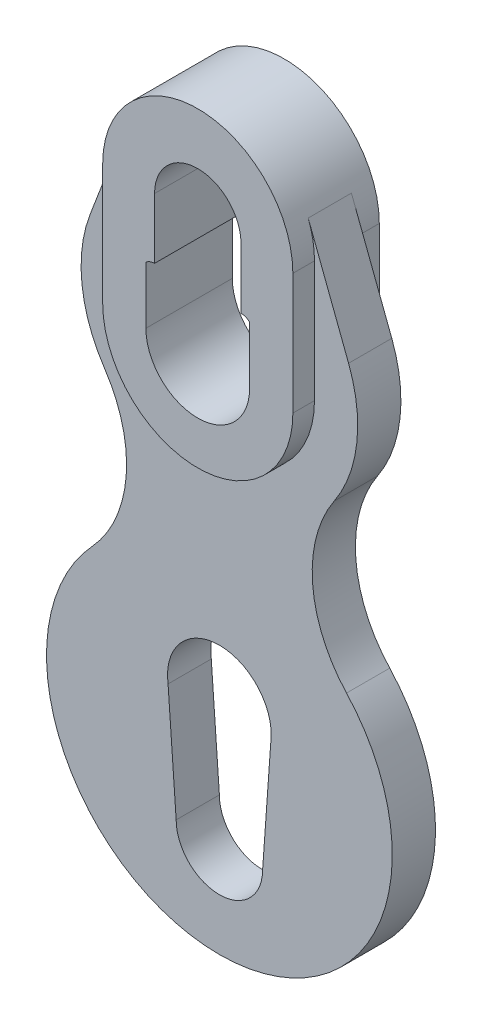
ISO-10303-21;
HEADER;
FILE_DESCRIPTION(('STEP AP214'),'2;1');
FILE_NAME('part.step','',(''),(''),'','','');
FILE_SCHEMA(('AUTOMOTIVE_DESIGN { 1 0 10303 214 1 1 1 1 }'));
ENDSEC;
DATA;
#1=APPLICATION_CONTEXT('core data for automotive mechanical design processes');
#2=APPLICATION_PROTOCOL_DEFINITION('international standard','automotive_design',2000,#1);
#3=PRODUCT_CONTEXT('',#1,'mechanical');
#4=PRODUCT('Part','Part','',(#3));
#5=PRODUCT_RELATED_PRODUCT_CATEGORY('part','',(#4));
#6=PRODUCT_DEFINITION_FORMATION('','',#4);
#7=PRODUCT_DEFINITION_CONTEXT('part definition',#1,'design');
#8=PRODUCT_DEFINITION('design','',#6,#7);
#9=PRODUCT_DEFINITION_SHAPE('','',#8);
#10=(LENGTH_UNIT() NAMED_UNIT(*) SI_UNIT(.MILLI.,.METRE.));
#11=(NAMED_UNIT(*) PLANE_ANGLE_UNIT() SI_UNIT($,.RADIAN.));
#12=(NAMED_UNIT(*) SI_UNIT($,.STERADIAN.) SOLID_ANGLE_UNIT());
#13=UNCERTAINTY_MEASURE_WITH_UNIT(LENGTH_MEASURE(1.E-05),#10,'distance_accuracy_value','');
#14=(GEOMETRIC_REPRESENTATION_CONTEXT(3) GLOBAL_UNCERTAINTY_ASSIGNED_CONTEXT((#13)) GLOBAL_UNIT_ASSIGNED_CONTEXT((#10,
#11,#12)) REPRESENTATION_CONTEXT('',''));
#15=CARTESIAN_POINT('',(0.,0.,0.));
#16=DIRECTION('',(0.,0.,1.));
#17=DIRECTION('',(1.,0.,0.));
#18=AXIS2_PLACEMENT_3D('',#15,#16,#17);
#19=CARTESIAN_POINT('',(22.,0.,10.));
#20=DIRECTION('',(1.,0.,0.));
#21=DIRECTION('',(0.,1.,0.));
#22=AXIS2_PLACEMENT_3D('',#19,#20,#21);
#23=PLANE('',#22);
#24=DIRECTION('',(0.,0.,-1.));
#25=VECTOR('',#24,1.);
#26=CARTESIAN_POINT('',(22.,110.000000000016,10.));
#27=LINE('',#26,#25);
#28=CARTESIAN_POINT('',(22.,110.000000000016,-5.));
#29=VERTEX_POINT('',#28);
#30=CARTESIAN_POINT('',(22.,110.000000000016,-10.));
#31=VERTEX_POINT('',#30);
#32=EDGE_CURVE('E46',#29,#31,#27,.T.);
#33=ORIENTED_EDGE('',*,*,#32,.F.);
#34=DIRECTION('',(0.,-1.,0.));
#35=VECTOR('',#34,1.);
#36=CARTESIAN_POINT('',(22.,0.,-5.));
#37=LINE('',#36,#35);
#38=CARTESIAN_POINT('',(22.,82.,-5.));
#39=VERTEX_POINT('',#38);
#40=EDGE_CURVE('E279',#29,#39,#37,.T.);
#41=ORIENTED_EDGE('',*,*,#40,.T.);
#42=DIRECTION('',(0.,0.,-1.));
#43=VECTOR('',#42,1.);
#44=CARTESIAN_POINT('',(22.,82.,10.));
#45=LINE('',#44,#43);
#46=CARTESIAN_POINT('',(22.,82.,-10.));
#47=VERTEX_POINT('',#46);
#48=EDGE_CURVE('E409',#39,#47,#45,.T.);
#49=ORIENTED_EDGE('',*,*,#48,.T.);
#50=DIRECTION('',(0.,-1.,0.));
#51=VECTOR('',#50,1.);
#52=CARTESIAN_POINT('',(22.,0.,-10.));
#53=LINE('',#52,#51);
#54=EDGE_CURVE('E394',#31,#47,#53,.T.);
#55=ORIENTED_EDGE('',*,*,#54,.F.);
#56=EDGE_LOOP('',(#33,#41,#49,#55));
#57=FACE_BOUND('',#56,.T.);
#58=ADVANCED_FACE('F37',(#57),#23,.T.);
#59=CARTESIAN_POINT('',(-22.,0.,10.));
#60=DIRECTION('',(1.,0.,0.));
#61=DIRECTION('',(0.,1.,0.));
#62=AXIS2_PLACEMENT_3D('',#59,#60,#61);
#63=PLANE('',#62);
#64=DIRECTION('',(0.,-1.,0.));
#65=VECTOR('',#64,1.);
#66=CARTESIAN_POINT('',(-22.,0.,-5.));
#67=LINE('',#66,#65);
#68=CARTESIAN_POINT('',(-22.,110.000000000016,-5.));
#69=VERTEX_POINT('',#68);
#70=CARTESIAN_POINT('',(-22.,82.,-5.));
#71=VERTEX_POINT('',#70);
#72=EDGE_CURVE('E286',#69,#71,#67,.T.);
#73=ORIENTED_EDGE('',*,*,#72,.F.);
#74=DIRECTION('',(0.,0.,-1.));
#75=VECTOR('',#74,1.);
#76=CARTESIAN_POINT('',(-22.,110.000000000016,10.));
#77=LINE('',#76,#75);
#78=CARTESIAN_POINT('',(-22.,110.000000000016,-10.));
#79=VERTEX_POINT('',#78);
#80=EDGE_CURVE('E413',#69,#79,#77,.T.);
#81=ORIENTED_EDGE('',*,*,#80,.T.);
#82=DIRECTION('',(0.,-1.,0.));
#83=VECTOR('',#82,1.);
#84=CARTESIAN_POINT('',(-22.,0.,-10.));
#85=LINE('',#84,#83);
#86=CARTESIAN_POINT('',(-22.,82.,-10.));
#87=VERTEX_POINT('',#86);
#88=EDGE_CURVE('E400',#79,#87,#85,.T.);
#89=ORIENTED_EDGE('',*,*,#88,.T.);
#90=DIRECTION('',(0.,0.,-1.));
#91=VECTOR('',#90,1.);
#92=CARTESIAN_POINT('',(-22.,82.,10.));
#93=LINE('',#92,#91);
#94=EDGE_CURVE('E408',#71,#87,#93,.T.);
#95=ORIENTED_EDGE('',*,*,#94,.F.);
#96=EDGE_LOOP('',(#73,#81,#89,#95));
#97=FACE_BOUND('',#96,.T.);
#98=ADVANCED_FACE('F456',(#97),#63,.F.);
#99=CARTESIAN_POINT('',(0.,82.,10.));
#100=DIRECTION('',(0.,0.,-1.));
#101=DIRECTION('',(-1.,0.,0.));
#102=AXIS2_PLACEMENT_3D('',#99,#100,#101);
#103=CYLINDRICAL_SURFACE('',#102,22.);
#104=CARTESIAN_POINT('',(0.,82.,-5.));
#105=DIRECTION('',(0.,0.,1.));
#106=DIRECTION('',(1.,0.,0.));
#107=AXIS2_PLACEMENT_3D('',#104,#105,#106);
#108=CIRCLE('',#107,22.);
#109=EDGE_CURVE('E283',#71,#39,#108,.T.);
#110=ORIENTED_EDGE('',*,*,#109,.F.);
#111=ORIENTED_EDGE('',*,*,#94,.T.);
#112=CARTESIAN_POINT('',(0.,82.,-10.));
#113=DIRECTION('',(0.,0.,1.));
#114=DIRECTION('',(1.,0.,0.));
#115=AXIS2_PLACEMENT_3D('',#112,#113,#114);
#116=CIRCLE('',#115,22.);
#117=EDGE_CURVE('E342',#87,#47,#116,.T.);
#118=ORIENTED_EDGE('',*,*,#117,.T.);
#119=ORIENTED_EDGE('',*,*,#48,.F.);
#120=EDGE_LOOP('',(#110,#111,#118,#119));
#121=FACE_BOUND('',#120,.T.);
#122=ADVANCED_FACE('F442',(#121),#103,.T.);
#123=DIRECTION('',(0.,-1.,0.));
#124=VECTOR('',#123,1.);
#125=CARTESIAN_POINT('',(22.,0.,5.));
#126=LINE('',#125,#124);
#127=CARTESIAN_POINT('',(22.,110.000000000016,5.));
#128=VERTEX_POINT('',#127);
#129=CARTESIAN_POINT('',(22.,82.,5.));
#130=VERTEX_POINT('',#129);
#131=EDGE_CURVE('E483',#128,#130,#126,.T.);
#132=ORIENTED_EDGE('',*,*,#131,.F.);
#133=CARTESIAN_POINT('',(22.,110.000000000016,10.));
#134=VERTEX_POINT('',#133);
#135=EDGE_CURVE('E11',#134,#128,#27,.T.);
#136=ORIENTED_EDGE('',*,*,#135,.F.);
#137=DIRECTION('',(0.,-1.,0.));
#138=VECTOR('',#137,1.);
#139=CARTESIAN_POINT('',(22.,0.,10.));
#140=LINE('',#139,#138);
#141=CARTESIAN_POINT('',(22.,82.,10.));
#142=VERTEX_POINT('',#141);
#143=EDGE_CURVE('E360',#134,#142,#140,.T.);
#144=ORIENTED_EDGE('',*,*,#143,.T.);
#145=EDGE_CURVE('E405',#142,#130,#45,.T.);
#146=ORIENTED_EDGE('',*,*,#145,.T.);
#147=EDGE_LOOP('',(#132,#136,#144,#146));
#148=FACE_BOUND('',#147,.T.);
#149=ADVANCED_FACE('F464',(#148),#23,.T.);
#150=CARTESIAN_POINT('',(0.,110.,10.));
#151=DIRECTION('',(0.,0.,-1.));
#152=DIRECTION('',(-1.,0.,0.));
#153=AXIS2_PLACEMENT_3D('',#150,#151,#152);
#154=CYLINDRICAL_SURFACE('',#153,22.);
#155=ORIENTED_EDGE('',*,*,#135,.T.);
#156=CARTESIAN_POINT('',(0.,110.,5.));
#157=DIRECTION('',(0.,0.,1.));
#158=DIRECTION('',(1.,0.,0.));
#159=AXIS2_PLACEMENT_3D('',#156,#157,#158);
#160=CIRCLE('',#159,22.);
#161=CARTESIAN_POINT('',(20.5490950195489,117.857142857143,5.));
#162=VERTEX_POINT('',#161);
#163=EDGE_CURVE('E53',#128,#162,#160,.T.);
#164=ORIENTED_EDGE('',*,*,#163,.T.);
#165=DIRECTION('',(0.,0.,-1.));
#166=VECTOR('',#165,1.);
#167=CARTESIAN_POINT('',(20.5490950195489,117.857142857143,5.));
#168=LINE('',#167,#166);
#169=CARTESIAN_POINT('',(20.5490950195489,117.857142857143,-5.));
#170=VERTEX_POINT('',#169);
#171=EDGE_CURVE('E58',#162,#170,#168,.T.);
#172=ORIENTED_EDGE('',*,*,#171,.T.);
#173=CARTESIAN_POINT('',(0.,110.,-5.));
#174=DIRECTION('',(0.,0.,1.));
#175=DIRECTION('',(1.,0.,0.));
#176=AXIS2_PLACEMENT_3D('',#173,#174,#175);
#177=CIRCLE('',#176,22.);
#178=EDGE_CURVE('E276',#29,#170,#177,.T.);
#179=ORIENTED_EDGE('',*,*,#178,.F.);
#180=ORIENTED_EDGE('',*,*,#32,.T.);
#181=CARTESIAN_POINT('',(0.,110.,-10.));
#182=DIRECTION('',(0.,0.,1.));
#183=DIRECTION('',(1.,0.,0.));
#184=AXIS2_PLACEMENT_3D('',#181,#182,#183);
#185=CIRCLE('',#184,22.);
#186=EDGE_CURVE('E397',#31,#79,#185,.T.);
#187=ORIENTED_EDGE('',*,*,#186,.T.);
#188=ORIENTED_EDGE('',*,*,#80,.F.);
#189=CARTESIAN_POINT('',(-20.5490950195489,117.857142857143,-5.));
#190=VERTEX_POINT('',#189);
#191=EDGE_CURVE('E280',#190,#69,#177,.T.);
#192=ORIENTED_EDGE('',*,*,#191,.F.);
#193=DIRECTION('',(0.,0.,-1.));
#194=VECTOR('',#193,1.);
#195=CARTESIAN_POINT('',(-20.5490950195489,117.857142857143,5.));
#196=LINE('',#195,#194);
#197=CARTESIAN_POINT('',(-20.5490950195489,117.857142857143,5.));
#198=VERTEX_POINT('',#197);
#199=EDGE_CURVE('E233',#198,#190,#196,.T.);
#200=ORIENTED_EDGE('',*,*,#199,.F.);
#201=CARTESIAN_POINT('',(-22.,110.000000000016,5.));
#202=VERTEX_POINT('',#201);
#203=EDGE_CURVE('E248',#198,#202,#160,.T.);
#204=ORIENTED_EDGE('',*,*,#203,.T.);
#205=CARTESIAN_POINT('',(-22.,110.000000000016,10.));
#206=VERTEX_POINT('',#205);
#207=EDGE_CURVE('E414',#206,#202,#77,.T.);
#208=ORIENTED_EDGE('',*,*,#207,.F.);
#209=CARTESIAN_POINT('',(0.,110.,10.));
#210=DIRECTION('',(0.,0.,1.));
#211=DIRECTION('',(1.,0.,0.));
#212=AXIS2_PLACEMENT_3D('',#209,#210,#211);
#213=CIRCLE('',#212,22.);
#214=EDGE_CURVE('E363',#134,#206,#213,.T.);
#215=ORIENTED_EDGE('',*,*,#214,.F.);
#216=EDGE_LOOP('',(#155,#164,#172,#179,#180,#187,#188,#192,#200,#204,#208,#215));
#217=FACE_BOUND('',#216,.T.);
#218=ADVANCED_FACE('F449',(#217),#154,.T.);
#219=ORIENTED_EDGE('',*,*,#207,.T.);
#220=DIRECTION('',(0.,-1.,0.));
#221=VECTOR('',#220,1.);
#222=CARTESIAN_POINT('',(-22.,0.,5.));
#223=LINE('',#222,#221);
#224=CARTESIAN_POINT('',(-22.,82.,5.));
#225=VERTEX_POINT('',#224);
#226=EDGE_CURVE('E250',#202,#225,#223,.T.);
#227=ORIENTED_EDGE('',*,*,#226,.T.);
#228=CARTESIAN_POINT('',(-22.,82.,10.));
#229=VERTEX_POINT('',#228);
#230=EDGE_CURVE('E410',#229,#225,#93,.T.);
#231=ORIENTED_EDGE('',*,*,#230,.F.);
#232=DIRECTION('',(0.,-1.,0.));
#233=VECTOR('',#232,1.);
#234=CARTESIAN_POINT('',(-22.,0.,10.));
#235=LINE('',#234,#233);
#236=EDGE_CURVE('E366',#206,#229,#235,.T.);
#237=ORIENTED_EDGE('',*,*,#236,.F.);
#238=EDGE_LOOP('',(#219,#227,#231,#237));
#239=FACE_BOUND('',#238,.T.);
#240=ADVANCED_FACE('F459',(#239),#63,.F.);
#241=CARTESIAN_POINT('',(9.99999999999999,0.,10.));
#242=DIRECTION('',(-1.,0.,0.));
#243=DIRECTION('',(0.,-1.,0.));
#244=AXIS2_PLACEMENT_3D('',#241,#242,#243);
#245=PLANE('',#244);
#246=DIRECTION('',(0.,1.,0.));
#247=VECTOR('',#246,1.);
#248=CARTESIAN_POINT('',(9.99999999999999,0.,-10.));
#249=LINE('',#248,#247);
#250=CARTESIAN_POINT('',(10.,96.,-10.));
#251=VERTEX_POINT('',#250);
#252=CARTESIAN_POINT('',(10.,110.,-10.));
#253=VERTEX_POINT('',#252);
#254=EDGE_CURVE('E324',#251,#253,#249,.T.);
#255=ORIENTED_EDGE('',*,*,#254,.F.);
#256=DIRECTION('',(0.,0.,-1.));
#257=VECTOR('',#256,1.);
#258=CARTESIAN_POINT('',(10.,96.,10.));
#259=LINE('',#258,#257);
#260=CARTESIAN_POINT('',(10.,96.,10.));
#261=VERTEX_POINT('',#260);
#262=EDGE_CURVE('E41',#261,#251,#259,.T.);
#263=ORIENTED_EDGE('',*,*,#262,.F.);
#264=DIRECTION('',(0.,1.,0.));
#265=VECTOR('',#264,1.);
#266=CARTESIAN_POINT('',(9.99999999999999,0.,10.));
#267=LINE('',#266,#265);
#268=CARTESIAN_POINT('',(10.,110.,10.));
#269=VERTEX_POINT('',#268);
#270=EDGE_CURVE('E338',#261,#269,#267,.T.);
#271=ORIENTED_EDGE('',*,*,#270,.T.);
#272=DIRECTION('',(0.,0.,-1.));
#273=VECTOR('',#272,1.);
#274=CARTESIAN_POINT('',(10.,110.,10.));
#275=LINE('',#274,#273);
#276=EDGE_CURVE('E371',#269,#253,#275,.T.);
#277=ORIENTED_EDGE('',*,*,#276,.T.);
#278=EDGE_LOOP('',(#255,#263,#271,#277));
#279=FACE_BOUND('',#278,.T.);
#280=ADVANCED_FACE('F39',(#279),#245,.T.);
#281=CARTESIAN_POINT('',(10.,93.,10.));
#282=DIRECTION('',(0.,0.,-1.));
#283=DIRECTION('',(-1.,0.,0.));
#284=AXIS2_PLACEMENT_3D('',#281,#282,#283);
#285=CYLINDRICAL_SURFACE('',#284,3.);
#286=CARTESIAN_POINT('',(10.,93.,-10.));
#287=DIRECTION('',(0.,0.,1.));
#288=DIRECTION('',(1.,0.,0.));
#289=AXIS2_PLACEMENT_3D('',#286,#287,#288);
#290=CIRCLE('',#289,3.);
#291=CARTESIAN_POINT('',(12.,95.2360679774998,-10.));
#292=VERTEX_POINT('',#291);
#293=EDGE_CURVE('E374',#251,#292,#290,.F.);
#294=ORIENTED_EDGE('',*,*,#293,.T.);
#295=DIRECTION('',(0.,0.,-1.));
#296=VECTOR('',#295,1.);
#297=CARTESIAN_POINT('',(12.,95.2360679774998,10.));
#298=LINE('',#297,#296);
#299=CARTESIAN_POINT('',(12.,95.2360679774998,10.));
#300=VERTEX_POINT('',#299);
#301=EDGE_CURVE('E427',#300,#292,#298,.T.);
#302=ORIENTED_EDGE('',*,*,#301,.F.);
#303=CARTESIAN_POINT('',(10.,93.,10.));
#304=DIRECTION('',(0.,0.,1.));
#305=DIRECTION('',(1.,0.,0.));
#306=AXIS2_PLACEMENT_3D('',#303,#304,#305);
#307=CIRCLE('',#306,3.);
#308=EDGE_CURVE('E341',#261,#300,#307,.F.);
#309=ORIENTED_EDGE('',*,*,#308,.F.);
#310=ORIENTED_EDGE('',*,*,#262,.T.);
#311=EDGE_LOOP('',(#294,#302,#309,#310));
#312=FACE_BOUND('',#311,.T.);
#313=ADVANCED_FACE('F475',(#312),#285,.F.);
#314=CARTESIAN_POINT('',(12.,0.,10.));
#315=DIRECTION('',(1.,0.,0.));
#316=DIRECTION('',(0.,0.,-1.));
#317=AXIS2_PLACEMENT_3D('',#314,#315,#316);
#318=PLANE('',#317);
#319=DIRECTION('',(0.,-1.,0.));
#320=VECTOR('',#319,1.);
#321=CARTESIAN_POINT('',(12.,0.,-10.));
#322=LINE('',#321,#320);
#323=CARTESIAN_POINT('',(12.,82.,-10.));
#324=VERTEX_POINT('',#323);
#325=EDGE_CURVE('E376',#292,#324,#322,.T.);
#326=ORIENTED_EDGE('',*,*,#325,.T.);
#327=DIRECTION('',(0.,0.,-1.));
#328=VECTOR('',#327,1.);
#329=CARTESIAN_POINT('',(12.,82.,10.));
#330=LINE('',#329,#328);
#331=CARTESIAN_POINT('',(12.,82.,10.));
#332=VERTEX_POINT('',#331);
#333=EDGE_CURVE('E426',#332,#324,#330,.T.);
#334=ORIENTED_EDGE('',*,*,#333,.F.);
#335=DIRECTION('',(0.,-1.,0.));
#336=VECTOR('',#335,1.);
#337=CARTESIAN_POINT('',(12.,0.,10.));
#338=LINE('',#337,#336);
#339=EDGE_CURVE('E344',#300,#332,#338,.T.);
#340=ORIENTED_EDGE('',*,*,#339,.F.);
#341=ORIENTED_EDGE('',*,*,#301,.T.);
#342=EDGE_LOOP('',(#326,#334,#340,#341));
#343=FACE_BOUND('',#342,.T.);
#344=ADVANCED_FACE('F727',(#343),#318,.F.);
#345=CARTESIAN_POINT('',(0.,82.,10.));
#346=DIRECTION('',(0.,0.,-1.));
#347=DIRECTION('',(-1.,0.,0.));
#348=AXIS2_PLACEMENT_3D('',#345,#346,#347);
#349=CYLINDRICAL_SURFACE('',#348,12.);
#350=CARTESIAN_POINT('',(0.,82.,-10.));
#351=DIRECTION('',(0.,0.,1.));
#352=DIRECTION('',(1.,0.,0.));
#353=AXIS2_PLACEMENT_3D('',#350,#351,#352);
#354=CIRCLE('',#353,12.);
#355=CARTESIAN_POINT('',(-12.,82.,-10.));
#356=VERTEX_POINT('',#355);
#357=EDGE_CURVE('E379',#356,#324,#354,.T.);
#358=ORIENTED_EDGE('',*,*,#357,.F.);
#359=DIRECTION('',(0.,0.,-1.));
#360=VECTOR('',#359,1.);
#361=CARTESIAN_POINT('',(-12.,82.,10.));
#362=LINE('',#361,#360);
#363=CARTESIAN_POINT('',(-12.,82.,10.));
#364=VERTEX_POINT('',#363);
#365=EDGE_CURVE('E424',#364,#356,#362,.T.);
#366=ORIENTED_EDGE('',*,*,#365,.F.);
#367=CARTESIAN_POINT('',(0.,82.,10.));
#368=DIRECTION('',(0.,0.,1.));
#369=DIRECTION('',(1.,0.,0.));
#370=AXIS2_PLACEMENT_3D('',#367,#368,#369);
#371=CIRCLE('',#370,12.);
#372=EDGE_CURVE('E346',#364,#332,#371,.T.);
#373=ORIENTED_EDGE('',*,*,#372,.T.);
#374=ORIENTED_EDGE('',*,*,#333,.T.);
#375=EDGE_LOOP('',(#358,#366,#373,#374));
#376=FACE_BOUND('',#375,.T.);
#377=ADVANCED_FACE('F716',(#376),#349,.F.);
#378=CARTESIAN_POINT('',(-12.,0.,10.));
#379=DIRECTION('',(1.,0.,0.));
#380=DIRECTION('',(0.,0.,-1.));
#381=AXIS2_PLACEMENT_3D('',#378,#379,#380);
#382=PLANE('',#381);
#383=DIRECTION('',(0.,-1.,0.));
#384=VECTOR('',#383,1.);
#385=CARTESIAN_POINT('',(-12.,0.,-10.));
#386=LINE('',#385,#384);
#387=CARTESIAN_POINT('',(-12.,95.2360679774998,-10.));
#388=VERTEX_POINT('',#387);
#389=EDGE_CURVE('E382',#388,#356,#386,.T.);
#390=ORIENTED_EDGE('',*,*,#389,.F.);
#391=DIRECTION('',(0.,0.,-1.));
#392=VECTOR('',#391,1.);
#393=CARTESIAN_POINT('',(-12.,95.2360679774998,10.));
#394=LINE('',#393,#392);
#395=CARTESIAN_POINT('',(-12.,95.2360679774998,10.));
#396=VERTEX_POINT('',#395);
#397=EDGE_CURVE('E422',#396,#388,#394,.T.);
#398=ORIENTED_EDGE('',*,*,#397,.F.);
#399=DIRECTION('',(0.,-1.,0.));
#400=VECTOR('',#399,1.);
#401=CARTESIAN_POINT('',(-12.,0.,10.));
#402=LINE('',#401,#400);
#403=EDGE_CURVE('E349',#396,#364,#402,.T.);
#404=ORIENTED_EDGE('',*,*,#403,.T.);
#405=ORIENTED_EDGE('',*,*,#365,.T.);
#406=EDGE_LOOP('',(#390,#398,#404,#405));
#407=FACE_BOUND('',#406,.T.);
#408=ADVANCED_FACE('F705',(#407),#382,.T.);
#409=CARTESIAN_POINT('',(-10.,93.,10.));
#410=DIRECTION('',(0.,0.,-1.));
#411=DIRECTION('',(-1.,0.,0.));
#412=AXIS2_PLACEMENT_3D('',#409,#410,#411);
#413=CYLINDRICAL_SURFACE('',#412,3.);
#414=CARTESIAN_POINT('',(-10.,93.,-10.));
#415=DIRECTION('',(0.,0.,1.));
#416=DIRECTION('',(1.,0.,0.));
#417=AXIS2_PLACEMENT_3D('',#414,#415,#416);
#418=CIRCLE('',#417,3.);
#419=CARTESIAN_POINT('',(-10.,96.,-10.));
#420=VERTEX_POINT('',#419);
#421=EDGE_CURVE('E385',#420,#388,#418,.T.);
#422=ORIENTED_EDGE('',*,*,#421,.F.);
#423=DIRECTION('',(0.,0.,-1.));
#424=VECTOR('',#423,1.);
#425=CARTESIAN_POINT('',(-10.,96.,10.));
#426=LINE('',#425,#424);
#427=CARTESIAN_POINT('',(-10.,96.,10.));
#428=VERTEX_POINT('',#427);
#429=EDGE_CURVE('E420',#428,#420,#426,.T.);
#430=ORIENTED_EDGE('',*,*,#429,.F.);
#431=CARTESIAN_POINT('',(-10.,93.,10.));
#432=DIRECTION('',(0.,0.,1.));
#433=DIRECTION('',(1.,0.,0.));
#434=AXIS2_PLACEMENT_3D('',#431,#432,#433);
#435=CIRCLE('',#434,3.);
#436=EDGE_CURVE('E352',#428,#396,#435,.T.);
#437=ORIENTED_EDGE('',*,*,#436,.T.);
#438=ORIENTED_EDGE('',*,*,#397,.T.);
#439=EDGE_LOOP('',(#422,#430,#437,#438));
#440=FACE_BOUND('',#439,.T.);
#441=ADVANCED_FACE('F694',(#440),#413,.F.);
#442=CARTESIAN_POINT('',(-9.99999999999999,0.,10.));
#443=DIRECTION('',(-1.,0.,0.));
#444=DIRECTION('',(0.,-1.,0.));
#445=AXIS2_PLACEMENT_3D('',#442,#443,#444);
#446=PLANE('',#445);
#447=DIRECTION('',(0.,1.,0.));
#448=VECTOR('',#447,1.);
#449=CARTESIAN_POINT('',(-9.99999999999999,0.,-10.));
#450=LINE('',#449,#448);
#451=CARTESIAN_POINT('',(-10.,110.,-10.));
#452=VERTEX_POINT('',#451);
#453=EDGE_CURVE('E388',#420,#452,#450,.T.);
#454=ORIENTED_EDGE('',*,*,#453,.T.);
#455=DIRECTION('',(0.,0.,-1.));
#456=VECTOR('',#455,1.);
#457=CARTESIAN_POINT('',(-10.,110.,10.));
#458=LINE('',#457,#456);
#459=CARTESIAN_POINT('',(-10.,110.,10.));
#460=VERTEX_POINT('',#459);
#461=EDGE_CURVE('E418',#460,#452,#458,.T.);
#462=ORIENTED_EDGE('',*,*,#461,.F.);
#463=DIRECTION('',(0.,1.,0.));
#464=VECTOR('',#463,1.);
#465=CARTESIAN_POINT('',(-9.99999999999999,0.,10.));
#466=LINE('',#465,#464);
#467=EDGE_CURVE('E355',#428,#460,#466,.T.);
#468=ORIENTED_EDGE('',*,*,#467,.F.);
#469=ORIENTED_EDGE('',*,*,#429,.T.);
#470=EDGE_LOOP('',(#454,#462,#468,#469));
#471=FACE_BOUND('',#470,.T.);
#472=ADVANCED_FACE('F499',(#471),#446,.F.);
#473=CARTESIAN_POINT('',(0.,110.,10.));
#474=DIRECTION('',(0.,0.,-1.));
#475=DIRECTION('',(-1.,0.,0.));
#476=AXIS2_PLACEMENT_3D('',#473,#474,#475);
#477=CYLINDRICAL_SURFACE('',#476,10.);
#478=CARTESIAN_POINT('',(0.,110.,-10.));
#479=DIRECTION('',(0.,0.,1.));
#480=DIRECTION('',(1.,0.,0.));
#481=AXIS2_PLACEMENT_3D('',#478,#479,#480);
#482=CIRCLE('',#481,10.);
#483=EDGE_CURVE('E391',#253,#452,#482,.T.);
#484=ORIENTED_EDGE('',*,*,#483,.F.);
#485=ORIENTED_EDGE('',*,*,#276,.F.);
#486=CARTESIAN_POINT('',(0.,110.,10.));
#487=DIRECTION('',(0.,0.,1.));
#488=DIRECTION('',(1.,0.,0.));
#489=AXIS2_PLACEMENT_3D('',#486,#487,#488);
#490=CIRCLE('',#489,10.);
#491=EDGE_CURVE('E357',#269,#460,#490,.T.);
#492=ORIENTED_EDGE('',*,*,#491,.T.);
#493=ORIENTED_EDGE('',*,*,#461,.T.);
#494=EDGE_LOOP('',(#484,#485,#492,#493));
#495=FACE_BOUND('',#494,.T.);
#496=ADVANCED_FACE('F492',(#495),#477,.F.);
#497=ORIENTED_EDGE('',*,*,#230,.T.);
#498=CARTESIAN_POINT('',(0.,82.,5.));
#499=DIRECTION('',(0.,0.,1.));
#500=DIRECTION('',(1.,0.,0.));
#501=AXIS2_PLACEMENT_3D('',#498,#499,#500);
#502=CIRCLE('',#501,22.);
#503=EDGE_CURVE('E482',#225,#130,#502,.T.);
#504=ORIENTED_EDGE('',*,*,#503,.T.);
#505=ORIENTED_EDGE('',*,*,#145,.F.);
#506=CARTESIAN_POINT('',(0.,82.,10.));
#507=DIRECTION('',(0.,0.,1.));
#508=DIRECTION('',(1.,0.,0.));
#509=AXIS2_PLACEMENT_3D('',#506,#507,#508);
#510=CIRCLE('',#509,22.);
#511=EDGE_CURVE('E369',#229,#142,#510,.T.);
#512=ORIENTED_EDGE('',*,*,#511,.F.);
#513=EDGE_LOOP('',(#497,#504,#505,#512));
#514=FACE_BOUND('',#513,.T.);
#515=ADVANCED_FACE('F466',(#514),#103,.T.);
#516=CARTESIAN_POINT('',(0.,0.,10.));
#517=DIRECTION('',(0.,0.,1.));
#518=DIRECTION('',(1.,0.,0.));
#519=AXIS2_PLACEMENT_3D('',#516,#517,#518);
#520=PLANE('',#519);
#521=ORIENTED_EDGE('',*,*,#270,.F.);
#522=ORIENTED_EDGE('',*,*,#308,.T.);
#523=ORIENTED_EDGE('',*,*,#339,.T.);
#524=ORIENTED_EDGE('',*,*,#372,.F.);
#525=ORIENTED_EDGE('',*,*,#403,.F.);
#526=ORIENTED_EDGE('',*,*,#436,.F.);
#527=ORIENTED_EDGE('',*,*,#467,.T.);
#528=ORIENTED_EDGE('',*,*,#491,.F.);
#529=EDGE_LOOP('',(#521,#522,#523,#524,#525,#526,#527,#528));
#530=FACE_BOUND('',#529,.T.);
#531=ORIENTED_EDGE('',*,*,#143,.F.);
#532=ORIENTED_EDGE('',*,*,#214,.T.);
#533=ORIENTED_EDGE('',*,*,#236,.T.);
#534=ORIENTED_EDGE('',*,*,#511,.T.);
#535=EDGE_LOOP('',(#531,#532,#533,#534));
#536=FACE_BOUND('',#535,.T.);
#537=ADVANCED_FACE('F490',(#530,#536),#520,.T.);
#538=CARTESIAN_POINT('',(0.,0.,-10.));
#539=DIRECTION('',(0.,0.,1.));
#540=DIRECTION('',(1.,0.,0.));
#541=AXIS2_PLACEMENT_3D('',#538,#539,#540);
#542=PLANE('',#541);
#543=ORIENTED_EDGE('',*,*,#254,.T.);
#544=ORIENTED_EDGE('',*,*,#483,.T.);
#545=ORIENTED_EDGE('',*,*,#453,.F.);
#546=ORIENTED_EDGE('',*,*,#421,.T.);
#547=ORIENTED_EDGE('',*,*,#389,.T.);
#548=ORIENTED_EDGE('',*,*,#357,.T.);
#549=ORIENTED_EDGE('',*,*,#325,.F.);
#550=ORIENTED_EDGE('',*,*,#293,.F.);
#551=EDGE_LOOP('',(#543,#544,#545,#546,#547,#548,#549,#550));
#552=FACE_BOUND('',#551,.T.);
#553=ORIENTED_EDGE('',*,*,#54,.T.);
#554=ORIENTED_EDGE('',*,*,#117,.F.);
#555=ORIENTED_EDGE('',*,*,#88,.F.);
#556=ORIENTED_EDGE('',*,*,#186,.F.);
#557=EDGE_LOOP('',(#553,#554,#555,#556));
#558=FACE_BOUND('',#557,.T.);
#559=ADVANCED_FACE('F447',(#552,#558),#542,.F.);
#560=CARTESIAN_POINT('',(0.,-18.,5.));
#561=DIRECTION('',(0.,0.,-1.));
#562=DIRECTION('',(-1.,0.,0.));
#563=AXIS2_PLACEMENT_3D('',#560,#561,#562);
#564=CYLINDRICAL_SURFACE('',#563,10.);
#565=CARTESIAN_POINT('',(0.,-18.,-5.));
#566=DIRECTION('',(0.,0.,1.));
#567=DIRECTION('',(1.,0.,0.));
#568=AXIS2_PLACEMENT_3D('',#565,#566,#567);
#569=CIRCLE('',#568,10.);
#570=CARTESIAN_POINT('',(-10.,-18.,-5.));
#571=VERTEX_POINT('',#570);
#572=CARTESIAN_POINT('',(10.,-18.,-5.));
#573=VERTEX_POINT('',#572);
#574=EDGE_CURVE('E304',#571,#573,#569,.T.);
#575=ORIENTED_EDGE('',*,*,#574,.F.);
#576=DIRECTION('',(0.,0.,-1.));
#577=VECTOR('',#576,1.);
#578=CARTESIAN_POINT('',(-10.,-18.,5.));
#579=LINE('',#578,#577);
#580=CARTESIAN_POINT('',(-10.,-18.,5.));
#581=VERTEX_POINT('',#580);
#582=EDGE_CURVE('E322',#581,#571,#579,.T.);
#583=ORIENTED_EDGE('',*,*,#582,.F.);
#584=CARTESIAN_POINT('',(0.,-18.,5.));
#585=DIRECTION('',(0.,0.,1.));
#586=DIRECTION('',(1.,0.,0.));
#587=AXIS2_PLACEMENT_3D('',#584,#585,#586);
#588=CIRCLE('',#587,10.);
#589=CARTESIAN_POINT('',(10.,-18.,5.));
#590=VERTEX_POINT('',#589);
#591=EDGE_CURVE('E265',#581,#590,#588,.T.);
#592=ORIENTED_EDGE('',*,*,#591,.T.);
#593=DIRECTION('',(0.,0.,-1.));
#594=VECTOR('',#593,1.);
#595=CARTESIAN_POINT('',(10.,-18.,5.));
#596=LINE('',#595,#594);
#597=EDGE_CURVE('E316',#590,#573,#596,.T.);
#598=ORIENTED_EDGE('',*,*,#597,.T.);
#599=EDGE_LOOP('',(#575,#583,#592,#598));
#600=FACE_BOUND('',#599,.T.);
#601=ADVANCED_FACE('F504',(#600),#564,.F.);
#602=CARTESIAN_POINT('',(-11.2284263959391,-0.802030456852791,5.));
#603=DIRECTION('',(0.997458699830735,0.0712470499879096,0.));
#604=DIRECTION('',(-0.0712470499879096,0.997458699830735,0.));
#605=AXIS2_PLACEMENT_3D('',#602,#603,#604);
#606=PLANE('',#605);
#607=DIRECTION('',(0.0712470499879096,-0.997458699830735,0.));
#608=VECTOR('',#607,1.);
#609=CARTESIAN_POINT('',(-11.2284263959391,-0.802030456852791,-5.));
#610=LINE('',#609,#608);
#611=CARTESIAN_POINT('',(-11.8781725888325,8.29441624365481,-5.));
#612=VERTEX_POINT('',#611);
#613=EDGE_CURVE('E307',#612,#571,#610,.T.);
#614=ORIENTED_EDGE('',*,*,#613,.F.);
#615=DIRECTION('',(0.,0.,-1.));
#616=VECTOR('',#615,1.);
#617=CARTESIAN_POINT('',(-11.8781725888325,8.29441624365481,5.));
#618=LINE('',#617,#616);
#619=CARTESIAN_POINT('',(-11.8781725888325,8.29441624365481,5.));
#620=VERTEX_POINT('',#619);
#621=EDGE_CURVE('E320',#620,#612,#618,.T.);
#622=ORIENTED_EDGE('',*,*,#621,.F.);
#623=DIRECTION('',(0.0712470499879096,-0.997458699830735,0.));
#624=VECTOR('',#623,1.);
#625=CARTESIAN_POINT('',(-11.2284263959391,-0.802030456852791,5.));
#626=LINE('',#625,#624);
#627=EDGE_CURVE('E268',#620,#581,#626,.T.);
#628=ORIENTED_EDGE('',*,*,#627,.T.);
#629=ORIENTED_EDGE('',*,*,#582,.T.);
#630=EDGE_LOOP('',(#614,#622,#628,#629));
#631=FACE_BOUND('',#630,.T.);
#632=ADVANCED_FACE('F535',(#631),#606,.T.);
#633=CARTESIAN_POINT('',(0.,10.,5.));
#634=DIRECTION('',(0.,0.,-1.));
#635=DIRECTION('',(-1.,0.,0.));
#636=AXIS2_PLACEMENT_3D('',#633,#634,#635);
#637=CYLINDRICAL_SURFACE('',#636,12.);
#638=CARTESIAN_POINT('',(0.,10.,-5.));
#639=DIRECTION('',(0.,0.,1.));
#640=DIRECTION('',(1.,0.,0.));
#641=AXIS2_PLACEMENT_3D('',#638,#639,#640);
#642=CIRCLE('',#641,12.);
#643=CARTESIAN_POINT('',(11.8781725888325,8.29441624365481,-5.));
#644=VERTEX_POINT('',#643);
#645=EDGE_CURVE('E310',#644,#612,#642,.T.);
#646=ORIENTED_EDGE('',*,*,#645,.F.);
#647=DIRECTION('',(0.,0.,-1.));
#648=VECTOR('',#647,1.);
#649=CARTESIAN_POINT('',(11.8781725888325,8.29441624365481,5.));
#650=LINE('',#649,#648);
#651=CARTESIAN_POINT('',(11.8781725888325,8.29441624365481,5.));
#652=VERTEX_POINT('',#651);
#653=EDGE_CURVE('E318',#652,#644,#650,.T.);
#654=ORIENTED_EDGE('',*,*,#653,.F.);
#655=CARTESIAN_POINT('',(0.,10.,5.));
#656=DIRECTION('',(0.,0.,1.));
#657=DIRECTION('',(1.,0.,0.));
#658=AXIS2_PLACEMENT_3D('',#655,#656,#657);
#659=CIRCLE('',#658,12.);
#660=EDGE_CURVE('E271',#652,#620,#659,.T.);
#661=ORIENTED_EDGE('',*,*,#660,.T.);
#662=ORIENTED_EDGE('',*,*,#621,.T.);
#663=EDGE_LOOP('',(#646,#654,#661,#662));
#664=FACE_BOUND('',#663,.T.);
#665=ADVANCED_FACE('F509',(#664),#637,.F.);
#666=CARTESIAN_POINT('',(-57.2439075544576,21.8877551020408,5.));
#667=DIRECTION('',(-0.934049773615859,0.357142857142857,0.));
#668=DIRECTION('',(-0.357142857142857,-0.934049773615859,0.));
#669=AXIS2_PLACEMENT_3D('',#666,#667,#668);
#670=PLANE('',#669);
#671=DIRECTION('',(0.357142857142857,0.934049773615859,0.));
#672=VECTOR('',#671,1.);
#673=CARTESIAN_POINT('',(-57.2439075544576,21.8877551020408,-5.));
#674=LINE('',#673,#672);
#675=CARTESIAN_POINT('',(-29.8895927557075,93.4285714285714,-5.));
#676=VERTEX_POINT('',#675);
#677=EDGE_CURVE('E230',#676,#190,#674,.T.);
#678=ORIENTED_EDGE('',*,*,#677,.F.);
#679=DIRECTION('',(0.,0.,-1.));
#680=VECTOR('',#679,1.);
#681=CARTESIAN_POINT('',(-29.8895927557075,93.4285714285714,5.));
#682=LINE('',#681,#680);
#683=CARTESIAN_POINT('',(-29.8895927557075,93.4285714285714,5.));
#684=VERTEX_POINT('',#683);
#685=EDGE_CURVE('E223',#684,#676,#682,.T.);
#686=ORIENTED_EDGE('',*,*,#685,.F.);
#687=DIRECTION('',(0.357142857142857,0.934049773615859,0.));
#688=VECTOR('',#687,1.);
#689=CARTESIAN_POINT('',(-57.2439075544576,21.8877551020408,5.));
#690=LINE('',#689,#688);
#691=EDGE_CURVE('E228',#684,#198,#690,.T.);
#692=ORIENTED_EDGE('',*,*,#691,.T.);
#693=ORIENTED_EDGE('',*,*,#199,.T.);
#694=EDGE_LOOP('',(#678,#686,#692,#693));
#695=FACE_BOUND('',#694,.T.);
#696=ADVANCED_FACE('F225',(#695),#670,.T.);
#697=CARTESIAN_POINT('',(0.,82.,5.));
#698=DIRECTION('',(0.,0.,-1.));
#699=DIRECTION('',(-1.,0.,0.));
#700=AXIS2_PLACEMENT_3D('',#697,#698,#699);
#701=CYLINDRICAL_SURFACE('',#700,32.);
#702=CARTESIAN_POINT('',(0.,82.,-5.));
#703=DIRECTION('',(0.,0.,1.));
#704=DIRECTION('',(1.,0.,0.));
#705=AXIS2_PLACEMENT_3D('',#702,#703,#704);
#706=CIRCLE('',#705,32.);
#707=CARTESIAN_POINT('',(-26.5670567955741,64.162077104642,-5.));
#708=VERTEX_POINT('',#707);
#709=EDGE_CURVE('E290',#676,#708,#706,.T.);
#710=ORIENTED_EDGE('',*,*,#709,.T.);
#711=DIRECTION('',(0.,0.,-1.));
#712=VECTOR('',#711,1.);
#713=CARTESIAN_POINT('',(-26.5670567955741,64.162077104642,5.));
#714=LINE('',#713,#712);
#715=CARTESIAN_POINT('',(-26.5670567955741,64.162077104642,5.));
#716=VERTEX_POINT('',#715);
#717=EDGE_CURVE('E234',#716,#708,#714,.T.);
#718=ORIENTED_EDGE('',*,*,#717,.F.);
#719=CARTESIAN_POINT('',(0.,82.,5.));
#720=DIRECTION('',(0.,0.,1.));
#721=DIRECTION('',(1.,0.,0.));
#722=AXIS2_PLACEMENT_3D('',#719,#720,#721);
#723=CIRCLE('',#722,32.);
#724=EDGE_CURVE('E237',#684,#716,#723,.T.);
#725=ORIENTED_EDGE('',*,*,#724,.F.);
#726=ORIENTED_EDGE('',*,*,#685,.T.);
#727=EDGE_LOOP('',(#710,#718,#725,#726));
#728=FACE_BOUND('',#727,.T.);
#729=ADVANCED_FACE('F238',(#728),#701,.T.);
#730=CARTESIAN_POINT('',(-51.4736725414249,47.4390243902439,5.));
#731=DIRECTION('',(0.,0.,-1.));
#732=DIRECTION('',(-1.,0.,0.));
#733=AXIS2_PLACEMENT_3D('',#730,#731,#732);
#734=CYLINDRICAL_SURFACE('',#733,30.);
#735=CARTESIAN_POINT('',(-51.4736725414249,47.4390243902439,-5.));
#736=DIRECTION('',(0.,0.,1.));
#737=DIRECTION('',(1.,0.,0.));
#738=AXIS2_PLACEMENT_3D('',#735,#736,#737);
#739=CIRCLE('',#738,30.);
#740=CARTESIAN_POINT('',(-29.4135271665285,27.1080139372822,-5.));
#741=VERTEX_POINT('',#740);
#742=EDGE_CURVE('E292',#708,#741,#739,.F.);
#743=ORIENTED_EDGE('',*,*,#742,.T.);
#744=DIRECTION('',(0.,0.,-1.));
#745=VECTOR('',#744,1.);
#746=CARTESIAN_POINT('',(-29.4135271665285,27.1080139372822,5.));
#747=LINE('',#746,#745);
#748=CARTESIAN_POINT('',(-29.4135271665285,27.1080139372822,5.));
#749=VERTEX_POINT('',#748);
#750=EDGE_CURVE('E333',#749,#741,#747,.T.);
#751=ORIENTED_EDGE('',*,*,#750,.F.);
#752=CARTESIAN_POINT('',(-51.4736725414249,47.4390243902439,5.));
#753=DIRECTION('',(0.,0.,1.));
#754=DIRECTION('',(1.,0.,0.));
#755=AXIS2_PLACEMENT_3D('',#752,#753,#754);
#756=CIRCLE('',#755,30.);
#757=EDGE_CURVE('E242',#716,#749,#756,.F.);
#758=ORIENTED_EDGE('',*,*,#757,.F.);
#759=ORIENTED_EDGE('',*,*,#717,.T.);
#760=EDGE_LOOP('',(#743,#751,#758,#759));
#761=FACE_BOUND('',#760,.T.);
#762=ADVANCED_FACE('F512',(#761),#734,.F.);
#763=CARTESIAN_POINT('',(0.,0.,5.));
#764=DIRECTION('',(0.,0.,-1.));
#765=DIRECTION('',(-1.,0.,0.));
#766=AXIS2_PLACEMENT_3D('',#763,#764,#765);
#767=CYLINDRICAL_SURFACE('',#766,40.);
#768=CARTESIAN_POINT('',(0.,0.,-5.));
#769=DIRECTION('',(0.,0.,1.));
#770=DIRECTION('',(1.,0.,0.));
#771=AXIS2_PLACEMENT_3D('',#768,#769,#770);
#772=CIRCLE('',#771,40.);
#773=CARTESIAN_POINT('',(29.4135271665285,27.1080139372822,-5.));
#774=VERTEX_POINT('',#773);
#775=EDGE_CURVE('E294',#741,#774,#772,.T.);
#776=ORIENTED_EDGE('',*,*,#775,.T.);
#777=DIRECTION('',(0.,0.,-1.));
#778=VECTOR('',#777,1.);
#779=CARTESIAN_POINT('',(29.4135271665285,27.1080139372822,5.));
#780=LINE('',#779,#778);
#781=CARTESIAN_POINT('',(29.4135271665285,27.1080139372822,5.));
#782=VERTEX_POINT('',#781);
#783=EDGE_CURVE('E331',#782,#774,#780,.T.);
#784=ORIENTED_EDGE('',*,*,#783,.F.);
#785=CARTESIAN_POINT('',(0.,0.,5.));
#786=DIRECTION('',(0.,0.,1.));
#787=DIRECTION('',(1.,0.,0.));
#788=AXIS2_PLACEMENT_3D('',#785,#786,#787);
#789=CIRCLE('',#788,40.);
#790=EDGE_CURVE('E256',#749,#782,#789,.T.);
#791=ORIENTED_EDGE('',*,*,#790,.F.);
#792=ORIENTED_EDGE('',*,*,#750,.T.);
#793=EDGE_LOOP('',(#776,#784,#791,#792));
#794=FACE_BOUND('',#793,.T.);
#795=ADVANCED_FACE('F515',(#794),#767,.T.);
#796=CARTESIAN_POINT('',(51.4736725414249,47.4390243902439,5.));
#797=DIRECTION('',(0.,0.,-1.));
#798=DIRECTION('',(-1.,0.,0.));
#799=AXIS2_PLACEMENT_3D('',#796,#797,#798);
#800=CYLINDRICAL_SURFACE('',#799,30.);
#801=CARTESIAN_POINT('',(51.4736725414249,47.4390243902439,-5.));
#802=DIRECTION('',(0.,0.,1.));
#803=DIRECTION('',(1.,0.,0.));
#804=AXIS2_PLACEMENT_3D('',#801,#802,#803);
#805=CIRCLE('',#804,30.);
#806=CARTESIAN_POINT('',(26.5670567955741,64.162077104642,-5.));
#807=VERTEX_POINT('',#806);
#808=EDGE_CURVE('E297',#807,#774,#805,.T.);
#809=ORIENTED_EDGE('',*,*,#808,.F.);
#810=DIRECTION('',(0.,0.,-1.));
#811=VECTOR('',#810,1.);
#812=CARTESIAN_POINT('',(26.5670567955741,64.162077104642,5.));
#813=LINE('',#812,#811);
#814=CARTESIAN_POINT('',(26.5670567955741,64.162077104642,5.));
#815=VERTEX_POINT('',#814);
#816=EDGE_CURVE('E329',#815,#807,#813,.T.);
#817=ORIENTED_EDGE('',*,*,#816,.F.);
#818=CARTESIAN_POINT('',(51.4736725414249,47.4390243902439,5.));
#819=DIRECTION('',(0.,0.,1.));
#820=DIRECTION('',(1.,0.,0.));
#821=AXIS2_PLACEMENT_3D('',#818,#819,#820);
#822=CIRCLE('',#821,30.);
#823=EDGE_CURVE('E258',#815,#782,#822,.T.);
#824=ORIENTED_EDGE('',*,*,#823,.T.);
#825=ORIENTED_EDGE('',*,*,#783,.T.);
#826=EDGE_LOOP('',(#809,#817,#824,#825));
#827=FACE_BOUND('',#826,.T.);
#828=ADVANCED_FACE('F519',(#827),#800,.F.);
#829=CARTESIAN_POINT('',(0.,82.,5.));
#830=DIRECTION('',(0.,0.,-1.));
#831=DIRECTION('',(-1.,0.,0.));
#832=AXIS2_PLACEMENT_3D('',#829,#830,#831);
#833=CYLINDRICAL_SURFACE('',#832,32.);
#834=CARTESIAN_POINT('',(0.,82.,-5.));
#835=DIRECTION('',(0.,0.,1.));
#836=DIRECTION('',(1.,0.,0.));
#837=AXIS2_PLACEMENT_3D('',#834,#835,#836);
#838=CIRCLE('',#837,32.);
#839=CARTESIAN_POINT('',(29.8895927557074,93.4285714285716,-5.));
#840=VERTEX_POINT('',#839);
#841=EDGE_CURVE('E300',#807,#840,#838,.T.);
#842=ORIENTED_EDGE('',*,*,#841,.T.);
#843=DIRECTION('',(0.,0.,-1.));
#844=VECTOR('',#843,1.);
#845=CARTESIAN_POINT('',(29.8895927557074,93.4285714285716,5.));
#846=LINE('',#845,#844);
#847=CARTESIAN_POINT('',(29.8895927557074,93.4285714285716,5.));
#848=VERTEX_POINT('',#847);
#849=EDGE_CURVE('E326',#848,#840,#846,.T.);
#850=ORIENTED_EDGE('',*,*,#849,.F.);
#851=CARTESIAN_POINT('',(0.,82.,5.));
#852=DIRECTION('',(0.,0.,1.));
#853=DIRECTION('',(1.,0.,0.));
#854=AXIS2_PLACEMENT_3D('',#851,#852,#853);
#855=CIRCLE('',#854,32.);
#856=EDGE_CURVE('E261',#815,#848,#855,.T.);
#857=ORIENTED_EDGE('',*,*,#856,.F.);
#858=ORIENTED_EDGE('',*,*,#816,.T.);
#859=EDGE_LOOP('',(#842,#850,#857,#858));
#860=FACE_BOUND('',#859,.T.);
#861=ADVANCED_FACE('F523',(#860),#833,.T.);
#862=CARTESIAN_POINT('',(57.2439075544576,21.8877551020408,5.));
#863=DIRECTION('',(-0.934049773615859,-0.357142857142857,0.));
#864=DIRECTION('',(0.357142857142857,-0.934049773615859,0.));
#865=AXIS2_PLACEMENT_3D('',#862,#863,#864);
#866=PLANE('',#865);
#867=DIRECTION('',(-0.357142857142857,0.934049773615859,0.));
#868=VECTOR('',#867,1.);
#869=CARTESIAN_POINT('',(57.2439075544576,21.8877551020408,-5.));
#870=LINE('',#869,#868);
#871=EDGE_CURVE('E302',#840,#170,#870,.T.);
#872=ORIENTED_EDGE('',*,*,#871,.T.);
#873=ORIENTED_EDGE('',*,*,#171,.F.);
#874=DIRECTION('',(-0.357142857142857,0.934049773615859,0.));
#875=VECTOR('',#874,1.);
#876=CARTESIAN_POINT('',(57.2439075544576,21.8877551020408,5.));
#877=LINE('',#876,#875);
#878=EDGE_CURVE('E263',#848,#162,#877,.T.);
#879=ORIENTED_EDGE('',*,*,#878,.F.);
#880=ORIENTED_EDGE('',*,*,#849,.T.);
#881=EDGE_LOOP('',(#872,#873,#879,#880));
#882=FACE_BOUND('',#881,.T.);
#883=ADVANCED_FACE('F527',(#882),#866,.F.);
#884=CARTESIAN_POINT('',(11.2284263959391,-0.802030456852791,5.));
#885=DIRECTION('',(0.997458699830735,-0.0712470499879096,0.));
#886=DIRECTION('',(0.0712470499879096,0.997458699830735,0.));
#887=AXIS2_PLACEMENT_3D('',#884,#885,#886);
#888=PLANE('',#887);
#889=DIRECTION('',(-0.0712470499879096,-0.997458699830735,0.));
#890=VECTOR('',#889,1.);
#891=CARTESIAN_POINT('',(11.2284263959391,-0.802030456852791,-5.));
#892=LINE('',#891,#890);
#893=EDGE_CURVE('E313',#644,#573,#892,.T.);
#894=ORIENTED_EDGE('',*,*,#893,.T.);
#895=ORIENTED_EDGE('',*,*,#597,.F.);
#896=DIRECTION('',(-0.0712470499879096,-0.997458699830735,0.));
#897=VECTOR('',#896,1.);
#898=CARTESIAN_POINT('',(11.2284263959391,-0.802030456852791,5.));
#899=LINE('',#898,#897);
#900=EDGE_CURVE('E274',#652,#590,#899,.T.);
#901=ORIENTED_EDGE('',*,*,#900,.F.);
#902=ORIENTED_EDGE('',*,*,#653,.T.);
#903=EDGE_LOOP('',(#894,#895,#901,#902));
#904=FACE_BOUND('',#903,.T.);
#905=ADVANCED_FACE('F531',(#904),#888,.F.);
#906=CARTESIAN_POINT('',(0.,0.,5.));
#907=DIRECTION('',(0.,0.,1.));
#908=DIRECTION('',(1.,0.,0.));
#909=AXIS2_PLACEMENT_3D('',#906,#907,#908);
#910=PLANE('',#909);
#911=ORIENTED_EDGE('',*,*,#163,.F.);
#912=ORIENTED_EDGE('',*,*,#131,.T.);
#913=ORIENTED_EDGE('',*,*,#503,.F.);
#914=ORIENTED_EDGE('',*,*,#226,.F.);
#915=ORIENTED_EDGE('',*,*,#203,.F.);
#916=ORIENTED_EDGE('',*,*,#691,.F.);
#917=ORIENTED_EDGE('',*,*,#724,.T.);
#918=ORIENTED_EDGE('',*,*,#757,.T.);
#919=ORIENTED_EDGE('',*,*,#790,.T.);
#920=ORIENTED_EDGE('',*,*,#823,.F.);
#921=ORIENTED_EDGE('',*,*,#856,.T.);
#922=ORIENTED_EDGE('',*,*,#878,.T.);
#923=EDGE_LOOP('',(#911,#912,#913,#914,#915,#916,#917,#918,#919,#920,#921,#922));
#924=FACE_BOUND('',#923,.T.);
#925=ORIENTED_EDGE('',*,*,#591,.F.);
#926=ORIENTED_EDGE('',*,*,#627,.F.);
#927=ORIENTED_EDGE('',*,*,#660,.F.);
#928=ORIENTED_EDGE('',*,*,#900,.T.);
#929=EDGE_LOOP('',(#925,#926,#927,#928));
#930=FACE_BOUND('',#929,.T.);
#931=ADVANCED_FACE('F245',(#924,#930),#910,.T.);
#932=CARTESIAN_POINT('',(0.,0.,-5.));
#933=DIRECTION('',(0.,0.,1.));
#934=DIRECTION('',(1.,0.,0.));
#935=AXIS2_PLACEMENT_3D('',#932,#933,#934);
#936=PLANE('',#935);
#937=ORIENTED_EDGE('',*,*,#178,.T.);
#938=ORIENTED_EDGE('',*,*,#871,.F.);
#939=ORIENTED_EDGE('',*,*,#841,.F.);
#940=ORIENTED_EDGE('',*,*,#808,.T.);
#941=ORIENTED_EDGE('',*,*,#775,.F.);
#942=ORIENTED_EDGE('',*,*,#742,.F.);
#943=ORIENTED_EDGE('',*,*,#709,.F.);
#944=ORIENTED_EDGE('',*,*,#677,.T.);
#945=ORIENTED_EDGE('',*,*,#191,.T.);
#946=ORIENTED_EDGE('',*,*,#72,.T.);
#947=ORIENTED_EDGE('',*,*,#109,.T.);
#948=ORIENTED_EDGE('',*,*,#40,.F.);
#949=EDGE_LOOP('',(#937,#938,#939,#940,#941,#942,#943,#944,#945,#946,#947,#948));
#950=FACE_BOUND('',#949,.T.);
#951=ORIENTED_EDGE('',*,*,#574,.T.);
#952=ORIENTED_EDGE('',*,*,#893,.F.);
#953=ORIENTED_EDGE('',*,*,#645,.T.);
#954=ORIENTED_EDGE('',*,*,#613,.T.);
#955=EDGE_LOOP('',(#951,#952,#953,#954));
#956=FACE_BOUND('',#955,.T.);
#957=ADVANCED_FACE('F452',(#950,#956),#936,.F.);
#958=CLOSED_SHELL('',(#58,#98,#122,#149,#218,#240,#280,#313,#344,#377,#408,#441,#472,#496,#515,
#537,#559,#601,#632,#665,#696,#729,#762,#795,#828,#861,#883,#905,#931,#957));
#959=MANIFOLD_SOLID_BREP('B2',#958);
#960=ADVANCED_BREP_SHAPE_REPRESENTATION('',(#18,#959),#14);
#961=SHAPE_DEFINITION_REPRESENTATION(#9,#960);
ENDSEC;
END-ISO-10303-21;
